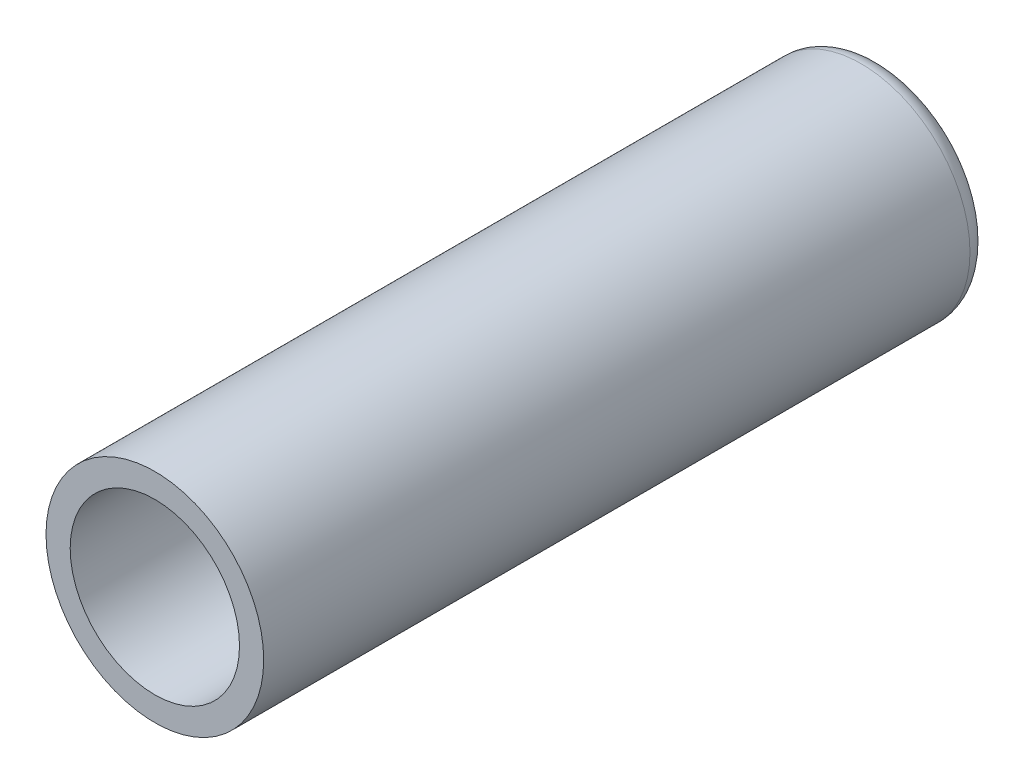
ISO-10303-21;
HEADER;
FILE_DESCRIPTION(('STEP AP214'),'2;1');
FILE_NAME('part.step','',(''),(''),'','','');
FILE_SCHEMA(('AUTOMOTIVE_DESIGN { 1 0 10303 214 1 1 1 1 }'));
ENDSEC;
DATA;
#1=APPLICATION_CONTEXT('core data for automotive mechanical design processes');
#2=APPLICATION_PROTOCOL_DEFINITION('international standard','automotive_design',2000,#1);
#3=PRODUCT_CONTEXT('',#1,'mechanical');
#4=PRODUCT('Part','Part','',(#3));
#5=PRODUCT_RELATED_PRODUCT_CATEGORY('part','',(#4));
#6=PRODUCT_DEFINITION_FORMATION('','',#4);
#7=PRODUCT_DEFINITION_CONTEXT('part definition',#1,'design');
#8=PRODUCT_DEFINITION('design','',#6,#7);
#9=PRODUCT_DEFINITION_SHAPE('','',#8);
#10=(LENGTH_UNIT() NAMED_UNIT(*) SI_UNIT(.MILLI.,.METRE.));
#11=(NAMED_UNIT(*) PLANE_ANGLE_UNIT() SI_UNIT($,.RADIAN.));
#12=(NAMED_UNIT(*) SI_UNIT($,.STERADIAN.) SOLID_ANGLE_UNIT());
#13=UNCERTAINTY_MEASURE_WITH_UNIT(LENGTH_MEASURE(1.E-05),#10,'distance_accuracy_value','');
#14=(GEOMETRIC_REPRESENTATION_CONTEXT(3) GLOBAL_UNCERTAINTY_ASSIGNED_CONTEXT((#13)) GLOBAL_UNIT_ASSIGNED_CONTEXT((#10,
#11,#12)) REPRESENTATION_CONTEXT('',''));
#15=CARTESIAN_POINT('',(0.,0.,0.));
#16=DIRECTION('',(0.,0.,1.));
#17=DIRECTION('',(1.,0.,0.));
#18=AXIS2_PLACEMENT_3D('',#15,#16,#17);
#19=CARTESIAN_POINT('',(0.,0.,95.25));
#20=DIRECTION('',(0.,0.,-1.));
#21=DIRECTION('',(-1.,0.,0.));
#22=AXIS2_PLACEMENT_3D('',#19,#20,#21);
#23=CYLINDRICAL_SURFACE('',#22,14.2875);
#24=CARTESIAN_POINT('',(0.,0.,2.54));
#25=DIRECTION('',(0.,0.,1.));
#26=DIRECTION('',(1.,0.,0.));
#27=AXIS2_PLACEMENT_3D('',#24,#25,#26);
#28=CIRCLE('',#27,14.2875);
#29=CARTESIAN_POINT('',(14.2875,0.,2.54));
#30=VERTEX_POINT('',#29);
#31=EDGE_CURVE('E39',#30,#30,#28,.T.);
#32=ORIENTED_EDGE('',*,*,#31,.T.);
#33=EDGE_LOOP('',(#32));
#34=FACE_BOUND('',#33,.T.);
#35=CARTESIAN_POINT('',(0.,0.,95.25));
#36=DIRECTION('',(0.,0.,1.));
#37=DIRECTION('',(1.,0.,0.));
#38=AXIS2_PLACEMENT_3D('',#35,#36,#37);
#39=CIRCLE('',#38,14.2875);
#40=CARTESIAN_POINT('',(14.2875,0.,95.25));
#41=VERTEX_POINT('',#40);
#42=EDGE_CURVE('E43',#41,#41,#39,.T.);
#43=ORIENTED_EDGE('',*,*,#42,.F.);
#44=EDGE_LOOP('',(#43));
#45=FACE_BOUND('',#44,.T.);
#46=ADVANCED_FACE('F32',(#34,#45),#23,.T.);
#47=CARTESIAN_POINT('',(0.,0.,95.25));
#48=DIRECTION('',(0.,0.,1.));
#49=DIRECTION('',(1.,0.,0.));
#50=AXIS2_PLACEMENT_3D('',#47,#48,#49);
#51=PLANE('',#50);
#52=CARTESIAN_POINT('',(0.,0.,95.25));
#53=DIRECTION('',(0.,0.,1.));
#54=DIRECTION('',(1.,0.,0.));
#55=AXIS2_PLACEMENT_3D('',#52,#53,#54);
#56=CIRCLE('',#55,11.1125);
#57=CARTESIAN_POINT('',(11.1125,0.,95.25));
#58=VERTEX_POINT('',#57);
#59=EDGE_CURVE('E52',#58,#58,#56,.T.);
#60=ORIENTED_EDGE('',*,*,#59,.F.);
#61=EDGE_LOOP('',(#60));
#62=FACE_BOUND('',#61,.T.);
#63=ORIENTED_EDGE('',*,*,#42,.T.);
#64=EDGE_LOOP('',(#63));
#65=FACE_BOUND('',#64,.T.);
#66=ADVANCED_FACE('F58',(#62,#65),#51,.T.);
#67=CARTESIAN_POINT('',(0.,0.,0.));
#68=DIRECTION('',(0.,0.,1.));
#69=DIRECTION('',(1.,0.,0.));
#70=AXIS2_PLACEMENT_3D('',#67,#68,#69);
#71=PLANE('',#70);
#72=CARTESIAN_POINT('',(0.,0.,0.));
#73=DIRECTION('',(0.,0.,1.));
#74=DIRECTION('',(1.,0.,0.));
#75=AXIS2_PLACEMENT_3D('',#72,#73,#74);
#76=CIRCLE('',#75,11.7475);
#77=CARTESIAN_POINT('',(11.7475,0.,0.));
#78=VERTEX_POINT('',#77);
#79=EDGE_CURVE('E11',#78,#78,#76,.F.);
#80=ORIENTED_EDGE('',*,*,#79,.T.);
#81=EDGE_LOOP('',(#80));
#82=FACE_BOUND('',#81,.T.);
#83=ADVANCED_FACE('F61',(#82),#71,.F.);
#84=CARTESIAN_POINT('',(0.,0.,-31.430896423742));
#85=DIRECTION('',(0.,0.,1.));
#86=DIRECTION('',(1.,0.,0.));
#87=AXIS2_PLACEMENT_3D('',#84,#85,#86);
#88=CYLINDRICAL_SURFACE('',#87,11.1125);
#89=CARTESIAN_POINT('',(0.,0.,3.175));
#90=DIRECTION('',(0.,0.,1.));
#91=DIRECTION('',(1.,0.,0.));
#92=AXIS2_PLACEMENT_3D('',#89,#90,#91);
#93=CIRCLE('',#92,11.1125);
#94=CARTESIAN_POINT('',(11.1125,0.,3.175));
#95=VERTEX_POINT('',#94);
#96=EDGE_CURVE('E47',#95,#95,#93,.F.);
#97=ORIENTED_EDGE('',*,*,#96,.T.);
#98=EDGE_LOOP('',(#97));
#99=FACE_BOUND('',#98,.T.);
#100=ORIENTED_EDGE('',*,*,#59,.T.);
#101=EDGE_LOOP('',(#100));
#102=FACE_BOUND('',#101,.T.);
#103=ADVANCED_FACE('F56',(#99,#102),#88,.F.);
#104=CARTESIAN_POINT('',(0.,0.,3.175));
#105=DIRECTION('',(0.,0.,1.));
#106=DIRECTION('',(1.,0.,0.));
#107=AXIS2_PLACEMENT_3D('',#104,#105,#106);
#108=PLANE('',#107);
#109=ORIENTED_EDGE('',*,*,#96,.F.);
#110=EDGE_LOOP('',(#109));
#111=FACE_BOUND('',#110,.T.);
#112=ADVANCED_FACE('F73',(#111),#108,.T.);
#113=CARTESIAN_POINT('',(0.,0.,2.54));
#114=DIRECTION('',(0.,0.,1.));
#115=DIRECTION('',(1.,0.,0.));
#116=AXIS2_PLACEMENT_3D('',#113,#114,#115);
#117=TOROIDAL_SURFACE('',#116,11.7475,2.54);
#118=ORIENTED_EDGE('',*,*,#79,.F.);
#119=EDGE_LOOP('',(#118));
#120=FACE_BOUND('',#119,.T.);
#121=ORIENTED_EDGE('',*,*,#31,.F.);
#122=EDGE_LOOP('',(#121));
#123=FACE_BOUND('',#122,.T.);
#124=ADVANCED_FACE('F34',(#120,#123),#117,.T.);
#125=CLOSED_SHELL('',(#46,#66,#83,#103,#112,#124));
#126=MANIFOLD_SOLID_BREP('B2',#125);
#127=ADVANCED_BREP_SHAPE_REPRESENTATION('',(#18,#126),#14);
#128=SHAPE_DEFINITION_REPRESENTATION(#9,#127);
ENDSEC;
END-ISO-10303-21;
